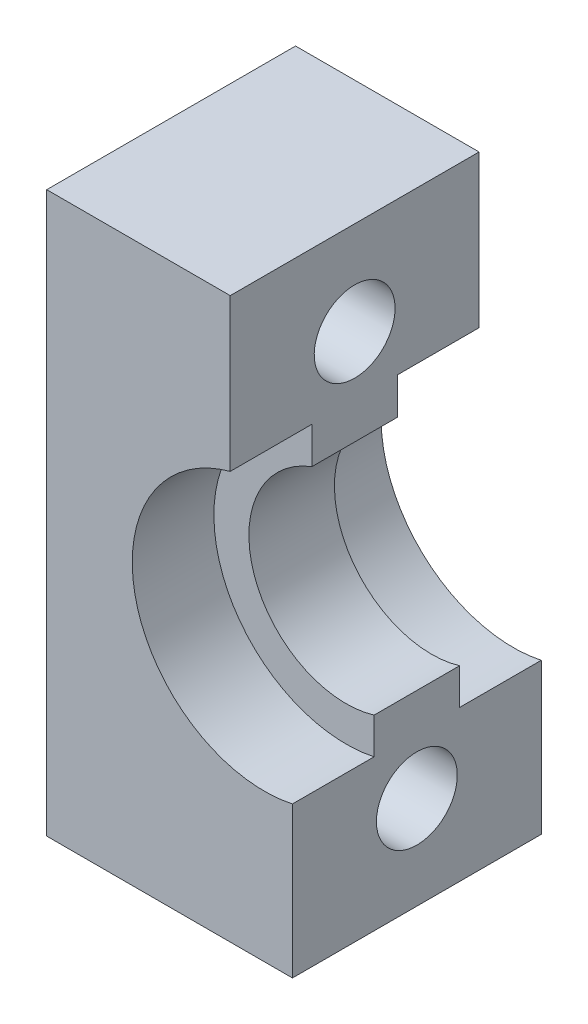
ISO-10303-21;
HEADER;
FILE_DESCRIPTION(('STEP AP214'),'2;1');
FILE_NAME('part.step','',(''),(''),'','','');
FILE_SCHEMA(('AUTOMOTIVE_DESIGN { 1 0 10303 214 1 1 1 1 }'));
ENDSEC;
DATA;
#1=APPLICATION_CONTEXT('core data for automotive mechanical design processes');
#2=APPLICATION_PROTOCOL_DEFINITION('international standard','automotive_design',2000,#1);
#3=PRODUCT_CONTEXT('',#1,'mechanical');
#4=PRODUCT('Part','Part','',(#3));
#5=PRODUCT_RELATED_PRODUCT_CATEGORY('part','',(#4));
#6=PRODUCT_DEFINITION_FORMATION('','',#4);
#7=PRODUCT_DEFINITION_CONTEXT('part definition',#1,'design');
#8=PRODUCT_DEFINITION('design','',#6,#7);
#9=PRODUCT_DEFINITION_SHAPE('','',#8);
#10=(LENGTH_UNIT() NAMED_UNIT(*) SI_UNIT(.MILLI.,.METRE.));
#11=(NAMED_UNIT(*) PLANE_ANGLE_UNIT() SI_UNIT($,.RADIAN.));
#12=(NAMED_UNIT(*) SI_UNIT($,.STERADIAN.) SOLID_ANGLE_UNIT());
#13=UNCERTAINTY_MEASURE_WITH_UNIT(LENGTH_MEASURE(1.E-05),#10,'distance_accuracy_value','');
#14=(GEOMETRIC_REPRESENTATION_CONTEXT(3) GLOBAL_UNCERTAINTY_ASSIGNED_CONTEXT((#13)) GLOBAL_UNIT_ASSIGNED_CONTEXT((#10,
#11,#12)) REPRESENTATION_CONTEXT('',''));
#15=CARTESIAN_POINT('',(0.,0.,0.));
#16=DIRECTION('',(0.,0.,1.));
#17=DIRECTION('',(1.,0.,0.));
#18=AXIS2_PLACEMENT_3D('',#15,#16,#17);
#19=CARTESIAN_POINT('',(14.,0.,8.));
#20=DIRECTION('',(0.,0.,-1.));
#21=DIRECTION('',(-1.,0.,0.));
#22=AXIS2_PLACEMENT_3D('',#19,#20,#21);
#23=CYLINDRICAL_SURFACE('',#22,8.5);
#24=CARTESIAN_POINT('',(14.,0.,-2.75));
#25=DIRECTION('',(0.,0.,1.));
#26=DIRECTION('',(1.,0.,0.));
#27=AXIS2_PLACEMENT_3D('',#24,#25,#26);
#28=CIRCLE('',#27,8.5);
#29=CARTESIAN_POINT('',(11.8,8.21035931004241,-2.75));
#30=VERTEX_POINT('',#29);
#31=CARTESIAN_POINT('',(15.8,-8.30722577037605,-2.75));
#32=VERTEX_POINT('',#31);
#33=EDGE_CURVE('E48',#30,#32,#28,.T.);
#34=ORIENTED_EDGE('',*,*,#33,.T.);
#35=DIRECTION('',(0.,0.,-1.));
#36=VECTOR('',#35,1.);
#37=CARTESIAN_POINT('',(15.8,-8.30722577037605,8.));
#38=LINE('',#37,#36);
#39=CARTESIAN_POINT('',(15.8,-8.30722577037605,-8.));
#40=VERTEX_POINT('',#39);
#41=EDGE_CURVE('E148',#32,#40,#38,.T.);
#42=ORIENTED_EDGE('',*,*,#41,.T.);
#43=CARTESIAN_POINT('',(14.,0.,-8.));
#44=DIRECTION('',(0.,0.,-1.));
#45=DIRECTION('',(1.,0.,0.));
#46=AXIS2_PLACEMENT_3D('',#43,#44,#45);
#47=CIRCLE('',#46,8.5);
#48=CARTESIAN_POINT('',(11.8,8.21035931004241,-8.));
#49=VERTEX_POINT('',#48);
#50=EDGE_CURVE('E137',#40,#49,#47,.T.);
#51=ORIENTED_EDGE('',*,*,#50,.T.);
#52=DIRECTION('',(0.,0.,-1.));
#53=VECTOR('',#52,1.);
#54=CARTESIAN_POINT('',(11.8,8.21035931004241,8.));
#55=LINE('',#54,#53);
#56=EDGE_CURVE('E121',#30,#49,#55,.T.);
#57=ORIENTED_EDGE('',*,*,#56,.F.);
#58=EDGE_LOOP('',(#34,#42,#51,#57));
#59=FACE_BOUND('',#58,.T.);
#60=ADVANCED_FACE('F33',(#59),#23,.F.);
#61=CARTESIAN_POINT('',(0.,-18.,8.));
#62=DIRECTION('',(0.,1.,0.));
#63=DIRECTION('',(0.,0.,1.));
#64=AXIS2_PLACEMENT_3D('',#61,#62,#63);
#65=PLANE('',#64);
#66=DIRECTION('',(1.,0.,0.));
#67=VECTOR('',#66,1.);
#68=CARTESIAN_POINT('',(0.,-18.,-8.));
#69=LINE('',#68,#67);
#70=CARTESIAN_POINT('',(0.,-18.,-8.));
#71=VERTEX_POINT('',#70);
#72=CARTESIAN_POINT('',(15.8,-18.,-8.));
#73=VERTEX_POINT('',#72);
#74=EDGE_CURVE('E130',#71,#73,#69,.T.);
#75=ORIENTED_EDGE('',*,*,#74,.T.);
#76=DIRECTION('',(0.,0.,-1.));
#77=VECTOR('',#76,1.);
#78=CARTESIAN_POINT('',(15.8,-18.,8.));
#79=LINE('',#78,#77);
#80=CARTESIAN_POINT('',(15.8,-18.,8.));
#81=VERTEX_POINT('',#80);
#82=EDGE_CURVE('E11',#81,#73,#79,.T.);
#83=ORIENTED_EDGE('',*,*,#82,.F.);
#84=DIRECTION('',(1.,0.,0.));
#85=VECTOR('',#84,1.);
#86=CARTESIAN_POINT('',(0.,-18.,8.));
#87=LINE('',#86,#85);
#88=CARTESIAN_POINT('',(0.,-18.,8.));
#89=VERTEX_POINT('',#88);
#90=EDGE_CURVE('E144',#89,#81,#87,.T.);
#91=ORIENTED_EDGE('',*,*,#90,.F.);
#92=DIRECTION('',(0.,0.,-1.));
#93=VECTOR('',#92,1.);
#94=CARTESIAN_POINT('',(0.,-18.,8.));
#95=LINE('',#94,#93);
#96=EDGE_CURVE('E126',#89,#71,#95,.T.);
#97=ORIENTED_EDGE('',*,*,#96,.T.);
#98=EDGE_LOOP('',(#75,#83,#91,#97));
#99=FACE_BOUND('',#98,.T.);
#100=ADVANCED_FACE('F35',(#99),#65,.F.);
#101=CARTESIAN_POINT('',(15.8,-18.,8.));
#102=DIRECTION('',(-1.,0.,0.));
#103=DIRECTION('',(0.,0.,1.));
#104=AXIS2_PLACEMENT_3D('',#101,#102,#103);
#105=PLANE('',#104);
#106=CARTESIAN_POINT('',(15.8,-12.,0.));
#107=DIRECTION('',(-1.,0.,0.));
#108=DIRECTION('',(0.,0.,1.));
#109=AXIS2_PLACEMENT_3D('',#106,#107,#108);
#110=CIRCLE('',#109,2.6);
#111=CARTESIAN_POINT('',(15.8,-12.,2.6));
#112=VERTEX_POINT('',#111);
#113=EDGE_CURVE('E202',#112,#112,#110,.T.);
#114=ORIENTED_EDGE('',*,*,#113,.T.);
#115=EDGE_LOOP('',(#114));
#116=FACE_BOUND('',#115,.T.);
#117=DIRECTION('',(0.,1.,0.));
#118=VECTOR('',#117,1.);
#119=CARTESIAN_POINT('',(15.8,-18.,-8.));
#120=LINE('',#119,#118);
#121=EDGE_CURVE('E133',#73,#40,#120,.T.);
#122=ORIENTED_EDGE('',*,*,#121,.T.);
#123=ORIENTED_EDGE('',*,*,#41,.F.);
#124=DIRECTION('',(0.,1.,0.));
#125=VECTOR('',#124,1.);
#126=CARTESIAN_POINT('',(15.8,-5.9851900554619,-2.75));
#127=LINE('',#126,#125);
#128=CARTESIAN_POINT('',(15.8,-5.9851900554619,-2.75));
#129=VERTEX_POINT('',#128);
#130=EDGE_CURVE('E176',#32,#129,#127,.T.);
#131=ORIENTED_EDGE('',*,*,#130,.T.);
#132=DIRECTION('',(0.,0.,-1.));
#133=VECTOR('',#132,1.);
#134=CARTESIAN_POINT('',(15.8,-5.9851900554619,2.75));
#135=LINE('',#134,#133);
#136=CARTESIAN_POINT('',(15.8,-5.9851900554619,2.75));
#137=VERTEX_POINT('',#136);
#138=EDGE_CURVE('E172',#137,#129,#135,.T.);
#139=ORIENTED_EDGE('',*,*,#138,.F.);
#140=DIRECTION('',(0.,1.,0.));
#141=VECTOR('',#140,1.);
#142=CARTESIAN_POINT('',(15.8,-5.9851900554619,2.75));
#143=LINE('',#142,#141);
#144=CARTESIAN_POINT('',(15.8,-8.30722577037605,2.75));
#145=VERTEX_POINT('',#144);
#146=EDGE_CURVE('E175',#145,#137,#143,.T.);
#147=ORIENTED_EDGE('',*,*,#146,.F.);
#148=CARTESIAN_POINT('',(15.8,-8.30722577037605,8.));
#149=VERTEX_POINT('',#148);
#150=EDGE_CURVE('E41',#149,#145,#38,.T.);
#151=ORIENTED_EDGE('',*,*,#150,.F.);
#152=DIRECTION('',(0.,1.,0.));
#153=VECTOR('',#152,1.);
#154=CARTESIAN_POINT('',(15.8,-18.,8.));
#155=LINE('',#154,#153);
#156=EDGE_CURVE('E92',#81,#149,#155,.T.);
#157=ORIENTED_EDGE('',*,*,#156,.F.);
#158=ORIENTED_EDGE('',*,*,#82,.T.);
#159=EDGE_LOOP('',(#122,#123,#131,#139,#147,#151,#157,#158));
#160=FACE_BOUND('',#159,.T.);
#161=ADVANCED_FACE('F159',(#116,#160),#105,.F.);
#162=ORIENTED_EDGE('',*,*,#150,.T.);
#163=CARTESIAN_POINT('',(14.,0.,2.75));
#164=DIRECTION('',(0.,0.,1.));
#165=DIRECTION('',(1.,0.,0.));
#166=AXIS2_PLACEMENT_3D('',#163,#164,#165);
#167=CIRCLE('',#166,8.5);
#168=CARTESIAN_POINT('',(11.8,8.2103593100424,2.75));
#169=VERTEX_POINT('',#168);
#170=EDGE_CURVE('E188',#169,#145,#167,.T.);
#171=ORIENTED_EDGE('',*,*,#170,.F.);
#172=CARTESIAN_POINT('',(11.8,8.21035931004241,8.));
#173=VERTEX_POINT('',#172);
#174=EDGE_CURVE('E147',#173,#169,#55,.T.);
#175=ORIENTED_EDGE('',*,*,#174,.F.);
#176=CARTESIAN_POINT('',(14.,0.,8.));
#177=DIRECTION('',(0.,0.,-1.));
#178=DIRECTION('',(1.,0.,0.));
#179=AXIS2_PLACEMENT_3D('',#176,#177,#178);
#180=CIRCLE('',#179,8.5);
#181=EDGE_CURVE('E109',#149,#173,#180,.T.);
#182=ORIENTED_EDGE('',*,*,#181,.F.);
#183=EDGE_LOOP('',(#162,#171,#175,#182));
#184=FACE_BOUND('',#183,.T.);
#185=ADVANCED_FACE('F218',(#184),#23,.F.);
#186=CARTESIAN_POINT('',(11.8,18.,8.));
#187=DIRECTION('',(-1.,0.,0.));
#188=DIRECTION('',(0.,-1.,0.));
#189=AXIS2_PLACEMENT_3D('',#186,#187,#188);
#190=PLANE('',#189);
#191=CARTESIAN_POINT('',(11.8,12.,0.));
#192=DIRECTION('',(-1.,0.,0.));
#193=DIRECTION('',(0.,-1.,0.));
#194=AXIS2_PLACEMENT_3D('',#191,#192,#193);
#195=CIRCLE('',#194,2.6);
#196=CARTESIAN_POINT('',(11.8,9.4,0.));
#197=VERTEX_POINT('',#196);
#198=EDGE_CURVE('E196',#197,#197,#195,.T.);
#199=ORIENTED_EDGE('',*,*,#198,.T.);
#200=EDGE_LOOP('',(#199));
#201=FACE_BOUND('',#200,.T.);
#202=DIRECTION('',(0.,1.,0.));
#203=VECTOR('',#202,1.);
#204=CARTESIAN_POINT('',(11.8,18.,-8.));
#205=LINE('',#204,#203);
#206=CARTESIAN_POINT('',(11.8,18.,-8.));
#207=VERTEX_POINT('',#206);
#208=EDGE_CURVE('E118',#49,#207,#205,.T.);
#209=ORIENTED_EDGE('',*,*,#208,.T.);
#210=DIRECTION('',(0.,0.,-1.));
#211=VECTOR('',#210,1.);
#212=CARTESIAN_POINT('',(11.8,18.,8.));
#213=LINE('',#212,#211);
#214=CARTESIAN_POINT('',(11.8,18.,8.));
#215=VERTEX_POINT('',#214);
#216=EDGE_CURVE('E115',#215,#207,#213,.T.);
#217=ORIENTED_EDGE('',*,*,#216,.F.);
#218=DIRECTION('',(0.,1.,0.));
#219=VECTOR('',#218,1.);
#220=CARTESIAN_POINT('',(11.8,18.,8.));
#221=LINE('',#220,#219);
#222=EDGE_CURVE('E102',#173,#215,#221,.T.);
#223=ORIENTED_EDGE('',*,*,#222,.F.);
#224=ORIENTED_EDGE('',*,*,#174,.T.);
#225=DIRECTION('',(0.,1.,0.));
#226=VECTOR('',#225,1.);
#227=CARTESIAN_POINT('',(11.8,8.2103593100424,2.75));
#228=LINE('',#227,#226);
#229=CARTESIAN_POINT('',(11.8,5.85,2.75));
#230=VERTEX_POINT('',#229);
#231=EDGE_CURVE('E191',#230,#169,#228,.T.);
#232=ORIENTED_EDGE('',*,*,#231,.F.);
#233=DIRECTION('',(0.,0.,-1.));
#234=VECTOR('',#233,1.);
#235=CARTESIAN_POINT('',(11.8,5.85,2.75));
#236=LINE('',#235,#234);
#237=CARTESIAN_POINT('',(11.8,5.85,-2.75));
#238=VERTEX_POINT('',#237);
#239=EDGE_CURVE('E134',#230,#238,#236,.T.);
#240=ORIENTED_EDGE('',*,*,#239,.T.);
#241=DIRECTION('',(0.,1.,0.));
#242=VECTOR('',#241,1.);
#243=CARTESIAN_POINT('',(11.8,8.2103593100424,-2.75));
#244=LINE('',#243,#242);
#245=EDGE_CURVE('E180',#238,#30,#244,.T.);
#246=ORIENTED_EDGE('',*,*,#245,.T.);
#247=ORIENTED_EDGE('',*,*,#56,.T.);
#248=EDGE_LOOP('',(#209,#217,#223,#224,#232,#240,#246,#247));
#249=FACE_BOUND('',#248,.T.);
#250=ADVANCED_FACE('F116',(#201,#249),#190,.F.);
#251=CARTESIAN_POINT('',(0.,18.,8.));
#252=DIRECTION('',(0.,-1.,0.));
#253=DIRECTION('',(0.,0.,-1.));
#254=AXIS2_PLACEMENT_3D('',#251,#252,#253);
#255=PLANE('',#254);
#256=DIRECTION('',(-1.,0.,0.));
#257=VECTOR('',#256,1.);
#258=CARTESIAN_POINT('',(0.,18.,-8.));
#259=LINE('',#258,#257);
#260=CARTESIAN_POINT('',(0.,18.,-8.));
#261=VERTEX_POINT('',#260);
#262=EDGE_CURVE('E141',#207,#261,#259,.T.);
#263=ORIENTED_EDGE('',*,*,#262,.T.);
#264=DIRECTION('',(0.,0.,-1.));
#265=VECTOR('',#264,1.);
#266=CARTESIAN_POINT('',(0.,18.,8.));
#267=LINE('',#266,#265);
#268=CARTESIAN_POINT('',(0.,18.,8.));
#269=VERTEX_POINT('',#268);
#270=EDGE_CURVE('E122',#269,#261,#267,.T.);
#271=ORIENTED_EDGE('',*,*,#270,.F.);
#272=DIRECTION('',(-1.,0.,0.));
#273=VECTOR('',#272,1.);
#274=CARTESIAN_POINT('',(0.,18.,8.));
#275=LINE('',#274,#273);
#276=EDGE_CURVE('E106',#215,#269,#275,.T.);
#277=ORIENTED_EDGE('',*,*,#276,.F.);
#278=ORIENTED_EDGE('',*,*,#216,.T.);
#279=EDGE_LOOP('',(#263,#271,#277,#278));
#280=FACE_BOUND('',#279,.T.);
#281=ADVANCED_FACE('F124',(#280),#255,.F.);
#282=CARTESIAN_POINT('',(0.,-18.,8.));
#283=DIRECTION('',(1.,0.,0.));
#284=DIRECTION('',(0.,0.,-1.));
#285=AXIS2_PLACEMENT_3D('',#282,#283,#284);
#286=PLANE('',#285);
#287=CARTESIAN_POINT('',(0.,-12.,0.));
#288=DIRECTION('',(1.,0.,0.));
#289=DIRECTION('',(0.,0.,-1.));
#290=AXIS2_PLACEMENT_3D('',#287,#288,#289);
#291=CIRCLE('',#290,2.6);
#292=CARTESIAN_POINT('',(0.,-12.,-2.6));
#293=VERTEX_POINT('',#292);
#294=EDGE_CURVE('E199',#293,#293,#291,.T.);
#295=ORIENTED_EDGE('',*,*,#294,.T.);
#296=EDGE_LOOP('',(#295));
#297=FACE_BOUND('',#296,.T.);
#298=CARTESIAN_POINT('',(0.,12.,0.));
#299=DIRECTION('',(1.,0.,0.));
#300=DIRECTION('',(0.,0.,-1.));
#301=AXIS2_PLACEMENT_3D('',#298,#299,#300);
#302=CIRCLE('',#301,2.6);
#303=CARTESIAN_POINT('',(0.,12.,-2.6));
#304=VERTEX_POINT('',#303);
#305=EDGE_CURVE('E185',#304,#304,#302,.T.);
#306=ORIENTED_EDGE('',*,*,#305,.T.);
#307=EDGE_LOOP('',(#306));
#308=FACE_BOUND('',#307,.T.);
#309=DIRECTION('',(0.,-1.,0.));
#310=VECTOR('',#309,1.);
#311=CARTESIAN_POINT('',(0.,-18.,-8.));
#312=LINE('',#311,#310);
#313=EDGE_CURVE('E84',#261,#71,#312,.T.);
#314=ORIENTED_EDGE('',*,*,#313,.T.);
#315=ORIENTED_EDGE('',*,*,#96,.F.);
#316=DIRECTION('',(0.,-1.,0.));
#317=VECTOR('',#316,1.);
#318=CARTESIAN_POINT('',(0.,-18.,8.));
#319=LINE('',#318,#317);
#320=EDGE_CURVE('E57',#269,#89,#319,.T.);
#321=ORIENTED_EDGE('',*,*,#320,.F.);
#322=ORIENTED_EDGE('',*,*,#270,.T.);
#323=EDGE_LOOP('',(#314,#315,#321,#322));
#324=FACE_BOUND('',#323,.T.);
#325=ADVANCED_FACE('F164',(#297,#308,#324),#286,.F.);
#326=CARTESIAN_POINT('',(14.,0.,8.));
#327=DIRECTION('',(0.,0.,1.));
#328=DIRECTION('',(1.,0.,0.));
#329=AXIS2_PLACEMENT_3D('',#326,#327,#328);
#330=PLANE('',#329);
#331=ORIENTED_EDGE('',*,*,#90,.T.);
#332=ORIENTED_EDGE('',*,*,#156,.T.);
#333=ORIENTED_EDGE('',*,*,#181,.T.);
#334=ORIENTED_EDGE('',*,*,#222,.T.);
#335=ORIENTED_EDGE('',*,*,#276,.T.);
#336=ORIENTED_EDGE('',*,*,#320,.T.);
#337=EDGE_LOOP('',(#331,#332,#333,#334,#335,#336));
#338=FACE_BOUND('',#337,.T.);
#339=ADVANCED_FACE('F104',(#338),#330,.T.);
#340=CARTESIAN_POINT('',(14.,0.,-8.));
#341=DIRECTION('',(0.,0.,1.));
#342=DIRECTION('',(1.,0.,0.));
#343=AXIS2_PLACEMENT_3D('',#340,#341,#342);
#344=PLANE('',#343);
#345=ORIENTED_EDGE('',*,*,#74,.F.);
#346=ORIENTED_EDGE('',*,*,#313,.F.);
#347=ORIENTED_EDGE('',*,*,#262,.F.);
#348=ORIENTED_EDGE('',*,*,#208,.F.);
#349=ORIENTED_EDGE('',*,*,#50,.F.);
#350=ORIENTED_EDGE('',*,*,#121,.F.);
#351=EDGE_LOOP('',(#345,#346,#347,#348,#349,#350));
#352=FACE_BOUND('',#351,.T.);
#353=ADVANCED_FACE('F163',(#352),#344,.F.);
#354=CARTESIAN_POINT('',(14.,0.,2.75));
#355=DIRECTION('',(0.,0.,-1.));
#356=DIRECTION('',(-1.,0.,0.));
#357=AXIS2_PLACEMENT_3D('',#354,#355,#356);
#358=CYLINDRICAL_SURFACE('',#357,6.25);
#359=CARTESIAN_POINT('',(14.,0.,-2.75));
#360=DIRECTION('',(0.,0.,-1.));
#361=DIRECTION('',(1.,0.,0.));
#362=AXIS2_PLACEMENT_3D('',#359,#360,#361);
#363=CIRCLE('',#362,6.25);
#364=EDGE_CURVE('E182',#129,#238,#363,.T.);
#365=ORIENTED_EDGE('',*,*,#364,.T.);
#366=ORIENTED_EDGE('',*,*,#239,.F.);
#367=CARTESIAN_POINT('',(14.,0.,2.75));
#368=DIRECTION('',(0.,0.,-1.));
#369=DIRECTION('',(1.,0.,0.));
#370=AXIS2_PLACEMENT_3D('',#367,#368,#369);
#371=CIRCLE('',#370,6.25);
#372=EDGE_CURVE('E178',#137,#230,#371,.T.);
#373=ORIENTED_EDGE('',*,*,#372,.F.);
#374=ORIENTED_EDGE('',*,*,#138,.T.);
#375=EDGE_LOOP('',(#365,#366,#373,#374));
#376=FACE_BOUND('',#375,.T.);
#377=ADVANCED_FACE('F237',(#376),#358,.F.);
#378=CARTESIAN_POINT('',(14.,0.,2.75));
#379=DIRECTION('',(0.,0.,1.));
#380=DIRECTION('',(1.,0.,0.));
#381=AXIS2_PLACEMENT_3D('',#378,#379,#380);
#382=PLANE('',#381);
#383=ORIENTED_EDGE('',*,*,#372,.T.);
#384=ORIENTED_EDGE('',*,*,#231,.T.);
#385=ORIENTED_EDGE('',*,*,#170,.T.);
#386=ORIENTED_EDGE('',*,*,#146,.T.);
#387=EDGE_LOOP('',(#383,#384,#385,#386));
#388=FACE_BOUND('',#387,.T.);
#389=ADVANCED_FACE('F242',(#388),#382,.T.);
#390=CARTESIAN_POINT('',(14.,0.,-2.75));
#391=DIRECTION('',(0.,0.,1.));
#392=DIRECTION('',(1.,0.,0.));
#393=AXIS2_PLACEMENT_3D('',#390,#391,#392);
#394=PLANE('',#393);
#395=ORIENTED_EDGE('',*,*,#364,.F.);
#396=ORIENTED_EDGE('',*,*,#130,.F.);
#397=ORIENTED_EDGE('',*,*,#33,.F.);
#398=ORIENTED_EDGE('',*,*,#245,.F.);
#399=EDGE_LOOP('',(#395,#396,#397,#398));
#400=FACE_BOUND('',#399,.T.);
#401=ADVANCED_FACE('F244',(#400),#394,.F.);
#402=CARTESIAN_POINT('',(15.801,12.,0.));
#403=DIRECTION('',(-1.,0.,0.));
#404=DIRECTION('',(0.,0.,1.));
#405=AXIS2_PLACEMENT_3D('',#402,#403,#404);
#406=CYLINDRICAL_SURFACE('',#405,2.6);
#407=ORIENTED_EDGE('',*,*,#305,.F.);
#408=EDGE_LOOP('',(#407));
#409=FACE_BOUND('',#408,.T.);
#410=ORIENTED_EDGE('',*,*,#198,.F.);
#411=EDGE_LOOP('',(#410));
#412=FACE_BOUND('',#411,.T.);
#413=ADVANCED_FACE('F213',(#409,#412),#406,.F.);
#414=CARTESIAN_POINT('',(15.801,-12.,0.));
#415=DIRECTION('',(-1.,0.,0.));
#416=DIRECTION('',(0.,0.,1.));
#417=AXIS2_PLACEMENT_3D('',#414,#415,#416);
#418=CYLINDRICAL_SURFACE('',#417,2.6);
#419=ORIENTED_EDGE('',*,*,#294,.F.);
#420=EDGE_LOOP('',(#419));
#421=FACE_BOUND('',#420,.T.);
#422=ORIENTED_EDGE('',*,*,#113,.F.);
#423=EDGE_LOOP('',(#422));
#424=FACE_BOUND('',#423,.T.);
#425=ADVANCED_FACE('F210',(#421,#424),#418,.F.);
#426=CLOSED_SHELL('',(#60,#100,#161,#185,#250,#281,#325,#339,#353,#377,#389,#401,#413,#425));
#427=MANIFOLD_SOLID_BREP('B2',#426);
#428=ADVANCED_BREP_SHAPE_REPRESENTATION('',(#18,#427),#14);
#429=SHAPE_DEFINITION_REPRESENTATION(#9,#428);
ENDSEC;
END-ISO-10303-21;
